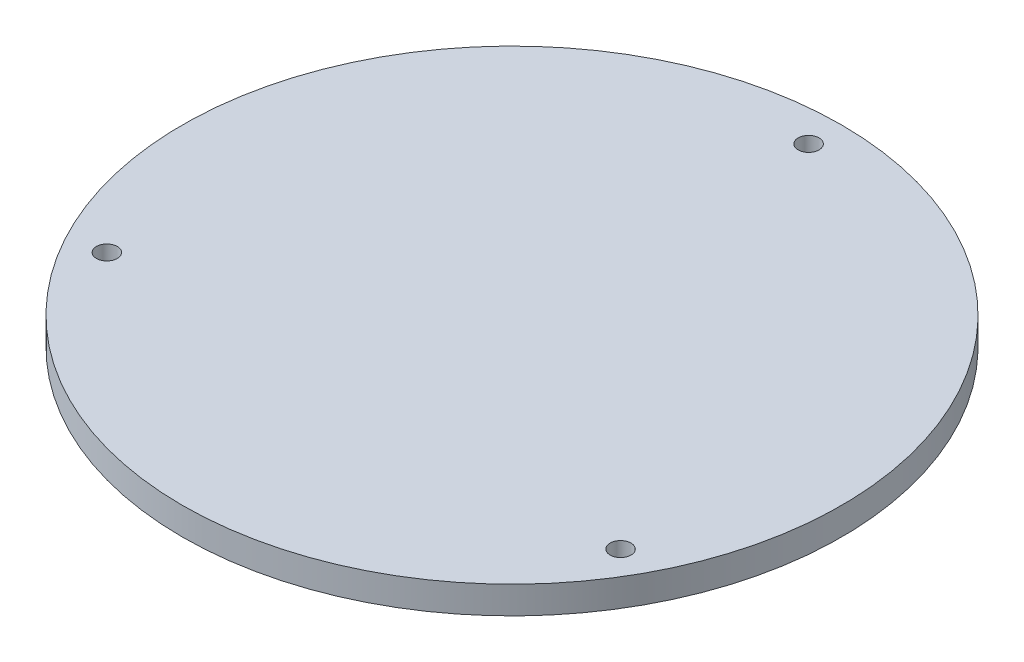
ISO-10303-21;
HEADER;
FILE_DESCRIPTION(('STEP AP214'),'2;1');
FILE_NAME('part.step','',(''),(''),'','','');
FILE_SCHEMA(('AUTOMOTIVE_DESIGN { 1 0 10303 214 1 1 1 1 }'));
ENDSEC;
DATA;
#1=APPLICATION_CONTEXT('core data for automotive mechanical design processes');
#2=APPLICATION_PROTOCOL_DEFINITION('international standard','automotive_design',2000,#1);
#3=PRODUCT_CONTEXT('',#1,'mechanical');
#4=PRODUCT('Part','Part','',(#3));
#5=PRODUCT_RELATED_PRODUCT_CATEGORY('part','',(#4));
#6=PRODUCT_DEFINITION_FORMATION('','',#4);
#7=PRODUCT_DEFINITION_CONTEXT('part definition',#1,'design');
#8=PRODUCT_DEFINITION('design','',#6,#7);
#9=PRODUCT_DEFINITION_SHAPE('','',#8);
#10=(LENGTH_UNIT() NAMED_UNIT(*) SI_UNIT(.MILLI.,.METRE.));
#11=(NAMED_UNIT(*) PLANE_ANGLE_UNIT() SI_UNIT($,.RADIAN.));
#12=(NAMED_UNIT(*) SI_UNIT($,.STERADIAN.) SOLID_ANGLE_UNIT());
#13=UNCERTAINTY_MEASURE_WITH_UNIT(LENGTH_MEASURE(1.E-05),#10,'distance_accuracy_value','');
#14=(GEOMETRIC_REPRESENTATION_CONTEXT(3) GLOBAL_UNCERTAINTY_ASSIGNED_CONTEXT((#13)) GLOBAL_UNIT_ASSIGNED_CONTEXT((#10,
#11,#12)) REPRESENTATION_CONTEXT('',''));
#15=CARTESIAN_POINT('',(0.,0.,0.));
#16=DIRECTION('',(0.,0.,1.));
#17=DIRECTION('',(1.,0.,0.));
#18=AXIS2_PLACEMENT_3D('',#15,#16,#17);
#19=CARTESIAN_POINT('',(0.,6.35,-68.58));
#20=DIRECTION('',(0.,-1.,0.));
#21=DIRECTION('',(0.,0.,-1.));
#22=AXIS2_PLACEMENT_3D('',#19,#20,#21);
#23=CYLINDRICAL_SURFACE('',#22,2.41299999999999);
#24=CARTESIAN_POINT('',(0.,6.35,-68.58));
#25=DIRECTION('',(0.,1.,0.));
#26=DIRECTION('',(0.,0.,1.));
#27=AXIS2_PLACEMENT_3D('',#24,#25,#26);
#28=CIRCLE('',#27,2.41299999999999);
#29=CARTESIAN_POINT('',(0.,6.35,-66.167));
#30=VERTEX_POINT('',#29);
#31=EDGE_CURVE('E47',#30,#30,#28,.T.);
#32=ORIENTED_EDGE('',*,*,#31,.T.);
#33=EDGE_LOOP('',(#32));
#34=FACE_BOUND('',#33,.T.);
#35=CARTESIAN_POINT('',(0.,0.,-68.58));
#36=DIRECTION('',(0.,1.,0.));
#37=DIRECTION('',(0.,0.,1.));
#38=AXIS2_PLACEMENT_3D('',#35,#36,#37);
#39=CIRCLE('',#38,2.41299999999999);
#40=CARTESIAN_POINT('',(0.,0.,-66.167));
#41=VERTEX_POINT('',#40);
#42=EDGE_CURVE('E61',#41,#41,#39,.T.);
#43=ORIENTED_EDGE('',*,*,#42,.F.);
#44=EDGE_LOOP('',(#43));
#45=FACE_BOUND('',#44,.T.);
#46=ADVANCED_FACE('F39',(#34,#45),#23,.F.);
#47=CARTESIAN_POINT('',(59.3920221915368,6.35,34.29));
#48=DIRECTION('',(0.,-1.,0.));
#49=DIRECTION('',(0.,0.,-1.));
#50=AXIS2_PLACEMENT_3D('',#47,#48,#49);
#51=CYLINDRICAL_SURFACE('',#50,2.41299999999999);
#52=CARTESIAN_POINT('',(59.3920221915368,6.35,34.29));
#53=DIRECTION('',(0.,1.,0.));
#54=DIRECTION('',(0.,0.,1.));
#55=AXIS2_PLACEMENT_3D('',#52,#53,#54);
#56=CIRCLE('',#55,2.41299999999999);
#57=CARTESIAN_POINT('',(59.3920221915368,6.35,36.703));
#58=VERTEX_POINT('',#57);
#59=EDGE_CURVE('E52',#58,#58,#56,.T.);
#60=ORIENTED_EDGE('',*,*,#59,.T.);
#61=EDGE_LOOP('',(#60));
#62=FACE_BOUND('',#61,.T.);
#63=CARTESIAN_POINT('',(59.3920221915368,0.,34.29));
#64=DIRECTION('',(0.,1.,0.));
#65=DIRECTION('',(0.,0.,1.));
#66=AXIS2_PLACEMENT_3D('',#63,#64,#65);
#67=CIRCLE('',#66,2.41299999999999);
#68=CARTESIAN_POINT('',(59.3920221915368,0.,36.703));
#69=VERTEX_POINT('',#68);
#70=EDGE_CURVE('E59',#69,#69,#67,.T.);
#71=ORIENTED_EDGE('',*,*,#70,.F.);
#72=EDGE_LOOP('',(#71));
#73=FACE_BOUND('',#72,.T.);
#74=ADVANCED_FACE('F76',(#62,#73),#51,.F.);
#75=CARTESIAN_POINT('',(-59.3920221915368,6.35,34.29));
#76=DIRECTION('',(0.,-1.,0.));
#77=DIRECTION('',(0.,0.,-1.));
#78=AXIS2_PLACEMENT_3D('',#75,#76,#77);
#79=CYLINDRICAL_SURFACE('',#78,2.41299999999999);
#80=CARTESIAN_POINT('',(-59.3920221915368,6.35,34.29));
#81=DIRECTION('',(0.,1.,0.));
#82=DIRECTION('',(0.,0.,1.));
#83=AXIS2_PLACEMENT_3D('',#80,#81,#82);
#84=CIRCLE('',#83,2.41299999999999);
#85=CARTESIAN_POINT('',(-59.3920221915368,6.35,36.703));
#86=VERTEX_POINT('',#85);
#87=EDGE_CURVE('E66',#86,#86,#84,.T.);
#88=ORIENTED_EDGE('',*,*,#87,.T.);
#89=EDGE_LOOP('',(#88));
#90=FACE_BOUND('',#89,.T.);
#91=CARTESIAN_POINT('',(-59.3920221915368,0.,34.29));
#92=DIRECTION('',(0.,1.,0.));
#93=DIRECTION('',(0.,0.,1.));
#94=AXIS2_PLACEMENT_3D('',#91,#92,#93);
#95=CIRCLE('',#94,2.41299999999999);
#96=CARTESIAN_POINT('',(-59.3920221915368,0.,36.703));
#97=VERTEX_POINT('',#96);
#98=EDGE_CURVE('E56',#97,#97,#95,.T.);
#99=ORIENTED_EDGE('',*,*,#98,.F.);
#100=EDGE_LOOP('',(#99));
#101=FACE_BOUND('',#100,.T.);
#102=ADVANCED_FACE('F41',(#90,#101),#79,.F.);
#103=CARTESIAN_POINT('',(0.,6.35,0.));
#104=DIRECTION('',(0.,-1.,0.));
#105=DIRECTION('',(0.,0.,-1.));
#106=AXIS2_PLACEMENT_3D('',#103,#104,#105);
#107=CYLINDRICAL_SURFACE('',#106,76.2);
#108=CARTESIAN_POINT('',(0.,6.35,0.));
#109=DIRECTION('',(0.,1.,0.));
#110=DIRECTION('',(0.,0.,1.));
#111=AXIS2_PLACEMENT_3D('',#108,#109,#110);
#112=CIRCLE('',#111,76.2);
#113=CARTESIAN_POINT('',(0.,6.35,76.2));
#114=VERTEX_POINT('',#113);
#115=EDGE_CURVE('E10',#114,#114,#112,.T.);
#116=ORIENTED_EDGE('',*,*,#115,.F.);
#117=EDGE_LOOP('',(#116));
#118=FACE_BOUND('',#117,.T.);
#119=CARTESIAN_POINT('',(0.,0.,0.));
#120=DIRECTION('',(0.,1.,0.));
#121=DIRECTION('',(0.,0.,1.));
#122=AXIS2_PLACEMENT_3D('',#119,#120,#121);
#123=CIRCLE('',#122,76.2);
#124=CARTESIAN_POINT('',(0.,0.,76.2));
#125=VERTEX_POINT('',#124);
#126=EDGE_CURVE('E43',#125,#125,#123,.T.);
#127=ORIENTED_EDGE('',*,*,#126,.T.);
#128=EDGE_LOOP('',(#127));
#129=FACE_BOUND('',#128,.T.);
#130=ADVANCED_FACE('F83',(#118,#129),#107,.T.);
#131=CARTESIAN_POINT('',(0.,6.35,0.));
#132=DIRECTION('',(0.,1.,0.));
#133=DIRECTION('',(0.,0.,1.));
#134=AXIS2_PLACEMENT_3D('',#131,#132,#133);
#135=PLANE('',#134);
#136=ORIENTED_EDGE('',*,*,#87,.F.);
#137=EDGE_LOOP('',(#136));
#138=FACE_BOUND('',#137,.T.);
#139=ORIENTED_EDGE('',*,*,#59,.F.);
#140=EDGE_LOOP('',(#139));
#141=FACE_BOUND('',#140,.T.);
#142=ORIENTED_EDGE('',*,*,#31,.F.);
#143=EDGE_LOOP('',(#142));
#144=FACE_BOUND('',#143,.T.);
#145=ORIENTED_EDGE('',*,*,#115,.T.);
#146=EDGE_LOOP('',(#145));
#147=FACE_BOUND('',#146,.T.);
#148=ADVANCED_FACE('F79',(#138,#141,#144,#147),#135,.T.);
#149=CARTESIAN_POINT('',(0.,0.,0.));
#150=DIRECTION('',(0.,1.,0.));
#151=DIRECTION('',(0.,0.,1.));
#152=AXIS2_PLACEMENT_3D('',#149,#150,#151);
#153=PLANE('',#152);
#154=ORIENTED_EDGE('',*,*,#98,.T.);
#155=EDGE_LOOP('',(#154));
#156=FACE_BOUND('',#155,.T.);
#157=ORIENTED_EDGE('',*,*,#70,.T.);
#158=EDGE_LOOP('',(#157));
#159=FACE_BOUND('',#158,.T.);
#160=ORIENTED_EDGE('',*,*,#42,.T.);
#161=EDGE_LOOP('',(#160));
#162=FACE_BOUND('',#161,.T.);
#163=ORIENTED_EDGE('',*,*,#126,.F.);
#164=EDGE_LOOP('',(#163));
#165=FACE_BOUND('',#164,.T.);
#166=ADVANCED_FACE('F82',(#156,#159,#162,#165),#153,.F.);
#167=CLOSED_SHELL('',(#46,#74,#102,#130,#148,#166));
#168=MANIFOLD_SOLID_BREP('B2',#167);
#169=ADVANCED_BREP_SHAPE_REPRESENTATION('',(#18,#168),#14);
#170=SHAPE_DEFINITION_REPRESENTATION(#9,#169);
ENDSEC;
END-ISO-10303-21;
